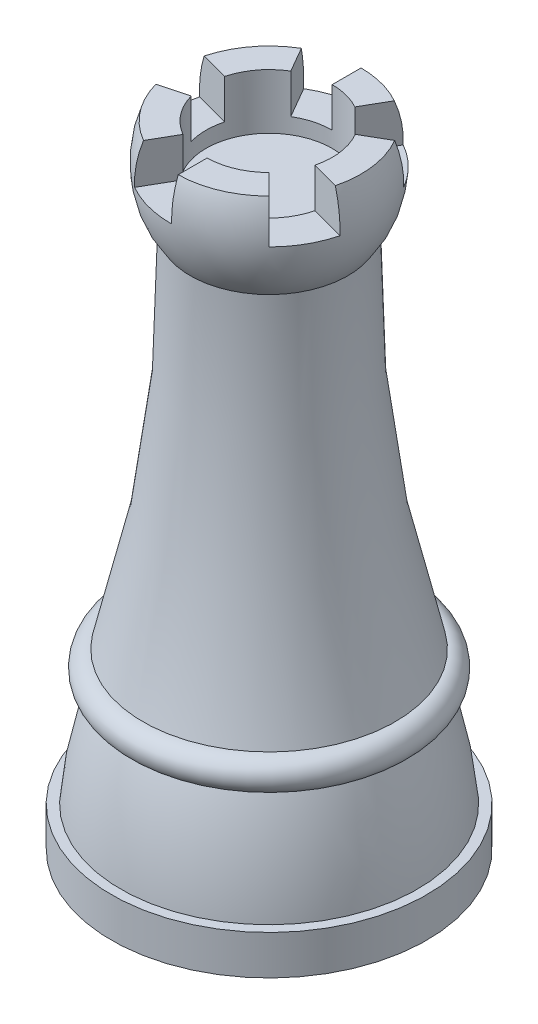
ISO-10303-21;
HEADER;
FILE_DESCRIPTION(('STEP AP214'),'2;1');
FILE_NAME('part.step','',(''),(''),'','','');
FILE_SCHEMA(('AUTOMOTIVE_DESIGN { 1 0 10303 214 1 1 1 1 }'));
ENDSEC;
DATA;
#1=APPLICATION_CONTEXT('core data for automotive mechanical design processes');
#2=APPLICATION_PROTOCOL_DEFINITION('international standard','automotive_design',2000,#1);
#3=PRODUCT_CONTEXT('',#1,'mechanical');
#4=PRODUCT('Part','Part','',(#3));
#5=PRODUCT_RELATED_PRODUCT_CATEGORY('part','',(#4));
#6=PRODUCT_DEFINITION_FORMATION('','',#4);
#7=PRODUCT_DEFINITION_CONTEXT('part definition',#1,'design');
#8=PRODUCT_DEFINITION('design','',#6,#7);
#9=PRODUCT_DEFINITION_SHAPE('','',#8);
#10=(LENGTH_UNIT() NAMED_UNIT(*) SI_UNIT(.MILLI.,.METRE.));
#11=(NAMED_UNIT(*) PLANE_ANGLE_UNIT() SI_UNIT($,.RADIAN.));
#12=(NAMED_UNIT(*) SI_UNIT($,.STERADIAN.) SOLID_ANGLE_UNIT());
#13=UNCERTAINTY_MEASURE_WITH_UNIT(LENGTH_MEASURE(1.E-05),#10,'distance_accuracy_value','');
#14=(GEOMETRIC_REPRESENTATION_CONTEXT(3) GLOBAL_UNCERTAINTY_ASSIGNED_CONTEXT((#13)) GLOBAL_UNIT_ASSIGNED_CONTEXT((#10,
#11,#12)) REPRESENTATION_CONTEXT('',''));
#15=CARTESIAN_POINT('',(0.,0.,0.));
#16=DIRECTION('',(0.,0.,1.));
#17=DIRECTION('',(1.,0.,0.));
#18=AXIS2_PLACEMENT_3D('',#15,#16,#17);
#19=CARTESIAN_POINT('',(0.,50.8,0.));
#20=DIRECTION('',(0.,1.,0.));
#21=DIRECTION('',(0.,0.,1.));
#22=AXIS2_PLACEMENT_3D('',#19,#20,#21);
#23=PLANE('',#22);
#24=DIRECTION('',(0.866025403784433,0.,-0.50000000000001));
#25=VECTOR('',#24,1.);
#26=CARTESIAN_POINT('',(8.79881810244979,50.8,-5.08000000000008));
#27=LINE('',#26,#25);
#28=CARTESIAN_POINT('',(4.39940905122492,50.8,-2.54000000000005));
#29=VERTEX_POINT('',#28);
#30=CARTESIAN_POINT('',(6.41318563585988,50.8,-3.70265445322684));
#31=VERTEX_POINT('',#30);
#32=EDGE_CURVE('E253',#29,#31,#27,.T.);
#33=ORIENTED_EDGE('',*,*,#32,.F.);
#34=CARTESIAN_POINT('',(0.,50.8,0.));
#35=DIRECTION('',(0.,1.,0.));
#36=DIRECTION('',(0.,0.,1.));
#37=AXIS2_PLACEMENT_3D('',#34,#35,#36);
#38=CIRCLE('',#37,5.08);
#39=CARTESIAN_POINT('',(4.92771782049568,50.8,1.23450276693466));
#40=VERTEX_POINT('',#39);
#41=EDGE_CURVE('E422',#40,#29,#38,.T.);
#42=ORIENTED_EDGE('',*,*,#41,.F.);
#43=DIRECTION('',(-0.965925826289071,0.,-0.25881904510251));
#44=VECTOR('',#43,1.);
#45=CARTESIAN_POINT('',(9.67726605474819,50.8,2.50714038071522));
#46=LINE('',#45,#44);
#47=CARTESIAN_POINT('',(7.17399918189662,50.8,1.83639204369509));
#48=VERTEX_POINT('',#47);
#49=EDGE_CURVE('E237',#48,#40,#46,.T.);
#50=ORIENTED_EDGE('',*,*,#49,.F.);
#51=CARTESIAN_POINT('',(0.,50.8,0.));
#52=DIRECTION('',(0.,-1.,0.));
#53=DIRECTION('',(0.,0.,-1.));
#54=AXIS2_PLACEMENT_3D('',#51,#52,#53);
#55=CIRCLE('',#54,7.40530890645353);
#56=EDGE_CURVE('E53',#31,#48,#55,.T.);
#57=ORIENTED_EDGE('',*,*,#56,.F.);
#58=EDGE_LOOP('',(#33,#42,#50,#57));
#59=FACE_BOUND('',#58,.T.);
#60=ADVANCED_FACE('F44',(#59),#23,.T.);
#61=DIRECTION('',(0.707106781186554,0.,0.707106781186541));
#62=VECTOR('',#61,1.);
#63=CARTESIAN_POINT('',(7.18420489685535,50.8,7.18420489685522));
#64=LINE('',#63,#62);
#65=CARTESIAN_POINT('',(3.59210244842769,50.8,3.59210244842763));
#66=VERTEX_POINT('',#65);
#67=CARTESIAN_POINT('',(5.23634414453447,50.8,5.23634414453438));
#68=VERTEX_POINT('',#67);
#69=EDGE_CURVE('E230',#66,#68,#64,.T.);
#70=ORIENTED_EDGE('',*,*,#69,.F.);
#71=CARTESIAN_POINT('',(0.0829491156278542,50.8,5.0793227347961));
#72=VERTEX_POINT('',#71);
#73=EDGE_CURVE('E438',#72,#66,#38,.T.);
#74=ORIENTED_EDGE('',*,*,#73,.F.);
#75=DIRECTION('',(0.,0.,-1.));
#76=VECTOR('',#75,1.);
#77=CARTESIAN_POINT('',(0.0829491156278967,50.8,9.99641688942648));
#78=LINE('',#77,#76);
#79=CARTESIAN_POINT('',(0.0829491156278753,50.8,7.40484432275362));
#80=VERTEX_POINT('',#79);
#81=EDGE_CURVE('E246',#80,#72,#78,.T.);
#82=ORIENTED_EDGE('',*,*,#81,.F.);
#83=EDGE_CURVE('E403',#68,#80,#55,.T.);
#84=ORIENTED_EDGE('',*,*,#83,.F.);
#85=EDGE_LOOP('',(#70,#74,#82,#84));
#86=FACE_BOUND('',#85,.T.);
#87=ADVANCED_FACE('F436',(#86),#23,.T.);
#88=DIRECTION('',(-0.499999999999995,0.,0.866025403784442));
#89=VECTOR('',#88,1.);
#90=CARTESIAN_POINT('',(-5.07999999999992,50.8,8.79881810244988));
#91=LINE('',#90,#89);
#92=CARTESIAN_POINT('',(-2.53999999999997,50.8,4.39940905122496));
#93=VERTEX_POINT('',#92);
#94=CARTESIAN_POINT('',(-3.70265445322673,50.8,6.41318563585994));
#95=VERTEX_POINT('',#94);
#96=EDGE_CURVE('E223',#93,#95,#91,.T.);
#97=ORIENTED_EDGE('',*,*,#96,.F.);
#98=CARTESIAN_POINT('',(-4.88478019869788,50.8,1.39474815304022));
#99=VERTEX_POINT('',#98);
#100=EDGE_CURVE('E213',#99,#93,#38,.T.);
#101=ORIENTED_EDGE('',*,*,#100,.F.);
#102=DIRECTION('',(0.965925826289067,0.,-0.258819045102526));
#103=VECTOR('',#102,1.);
#104=CARTESIAN_POINT('',(-9.63432843295037,50.8,2.66738576682087));
#105=LINE('',#104,#103);
#106=CARTESIAN_POINT('',(-7.13106156009881,50.8,1.9966374298007));
#107=VERTEX_POINT('',#106);
#108=EDGE_CURVE('E215',#107,#99,#105,.T.);
#109=ORIENTED_EDGE('',*,*,#108,.F.);
#110=EDGE_CURVE('E396',#95,#107,#55,.T.);
#111=ORIENTED_EDGE('',*,*,#110,.F.);
#112=EDGE_LOOP('',(#97,#101,#109,#111));
#113=FACE_BOUND('',#112,.T.);
#114=ADVANCED_FACE('F446',(#113),#23,.T.);
#115=DIRECTION('',(-0.965925826289069,0.,-0.258819045102518));
#116=VECTOR('',#115,1.);
#117=CARTESIAN_POINT('',(-9.81380639509689,50.8,-2.62960149824157));
#118=LINE('',#117,#116);
#119=CARTESIAN_POINT('',(-4.90690319754847,50.8,-1.31480074912079));
#120=VERTEX_POINT('',#119);
#121=CARTESIAN_POINT('',(-7.15297912439193,50.8,-1.91663497985747));
#122=VERTEX_POINT('',#121);
#123=EDGE_CURVE('E219',#120,#122,#118,.T.);
#124=ORIENTED_EDGE('',*,*,#123,.F.);
#125=CARTESIAN_POINT('',(-2.6114974087532,50.8,-4.35734796453936));
#126=VERTEX_POINT('',#125);
#127=EDGE_CURVE('E368',#126,#120,#38,.T.);
#128=ORIENTED_EDGE('',*,*,#127,.F.);
#129=DIRECTION('',(0.500000000000002,0.,0.866025403784437));
#130=VECTOR('',#129,1.);
#131=CARTESIAN_POINT('',(-5.0700444860684,50.8,-8.61567641524923));
#132=LINE('',#131,#130);
#133=CARTESIAN_POINT('',(-3.77425820273197,50.8,-6.3713087367597));
#134=VERTEX_POINT('',#133);
#135=EDGE_CURVE('E326',#134,#126,#132,.T.);
#136=ORIENTED_EDGE('',*,*,#135,.F.);
#137=EDGE_CURVE('E54',#122,#134,#55,.T.);
#138=ORIENTED_EDGE('',*,*,#137,.F.);
#139=EDGE_LOOP('',(#124,#128,#136,#138));
#140=FACE_BOUND('',#139,.T.);
#141=ADVANCED_FACE('F460',(#140),#23,.T.);
#142=DIRECTION('',(-0.499999999999988,0.,0.866025403784446));
#143=VECTOR('',#142,1.);
#144=CARTESIAN_POINT('',(4.92637240335798,50.8,-8.69862553087713));
#145=LINE('',#144,#143);
#146=CARTESIAN_POINT('',(3.63058612002158,50.8,-6.45425785238757));
#147=VERTEX_POINT('',#146);
#148=CARTESIAN_POINT('',(2.46782532604285,50.8,-4.44029708016722));
#149=VERTEX_POINT('',#148);
#150=EDGE_CURVE('E260',#147,#149,#145,.T.);
#151=ORIENTED_EDGE('',*,*,#150,.F.);
#152=CARTESIAN_POINT('',(0.,50.8,-7.40530890645353));
#153=VERTEX_POINT('',#152);
#154=EDGE_CURVE('E11',#153,#147,#55,.T.);
#155=ORIENTED_EDGE('',*,*,#154,.F.);
#156=DIRECTION('',(0.,0.,-1.));
#157=VECTOR('',#156,1.);
#158=CARTESIAN_POINT('',(0.,50.8,-10.1599999999999));
#159=LINE('',#158,#157);
#160=CARTESIAN_POINT('',(0.,50.8,-5.08));
#161=VERTEX_POINT('',#160);
#162=EDGE_CURVE('E332',#161,#153,#159,.T.);
#163=ORIENTED_EDGE('',*,*,#162,.F.);
#164=EDGE_CURVE('E362',#149,#161,#38,.T.);
#165=ORIENTED_EDGE('',*,*,#164,.F.);
#166=EDGE_LOOP('',(#151,#155,#163,#165));
#167=FACE_BOUND('',#166,.T.);
#168=ADVANCED_FACE('F46',(#167),#23,.T.);
#169=CARTESIAN_POINT('',(0.,47.9425,0.));
#170=DIRECTION('',(0.,-1.,0.));
#171=DIRECTION('',(1.,0.,0.));
#172=AXIS2_PLACEMENT_3D('',#169,#170,#171);
#173=SPHERICAL_SURFACE('',#172,7.9375);
#174=CARTESIAN_POINT('',(0.,47.9425,0.));
#175=DIRECTION('',(0.50000000000001,0.,0.866025403784433));
#176=DIRECTION('',(0.866025403784433,0.,-0.50000000000001));
#177=AXIS2_PLACEMENT_3D('',#174,#175,#176);
#178=CIRCLE('',#177,7.9375);
#179=CARTESIAN_POINT('',(6.86857517975886,47.625,-3.96557372898306));
#180=VERTEX_POINT('',#179);
#181=EDGE_CURVE('E323',#31,#180,#178,.F.);
#182=ORIENTED_EDGE('',*,*,#181,.F.);
#183=ORIENTED_EDGE('',*,*,#56,.T.);
#184=CARTESIAN_POINT('',(0.0214688108988885,47.9425,-0.0801226930527438));
#185=DIRECTION('',(0.25881904510251,0.,-0.965925826289071));
#186=DIRECTION('',(-0.965925826289071,0.,-0.25881904510251));
#187=AXIS2_PLACEMENT_3D('',#184,#185,#186);
#188=CIRCLE('',#187,7.9370665673293);
#189=CARTESIAN_POINT('',(7.68194997349271,47.625,1.97249704809801));
#190=VERTEX_POINT('',#189);
#191=EDGE_CURVE('E310',#190,#48,#188,.F.);
#192=ORIENTED_EDGE('',*,*,#191,.F.);
#193=CARTESIAN_POINT('',(0.,47.625,0.));
#194=DIRECTION('',(0.,1.,0.));
#195=DIRECTION('',(0.,0.,1.));
#196=AXIS2_PLACEMENT_3D('',#193,#194,#195);
#197=CIRCLE('',#196,7.93114745796597);
#198=CARTESIAN_POINT('',(5.60816815011823,47.625,5.60816815011813));
#199=VERTEX_POINT('',#198);
#200=EDGE_CURVE('E306',#190,#199,#197,.F.);
#201=ORIENTED_EDGE('',*,*,#200,.T.);
#202=CARTESIAN_POINT('',(0.,47.9425,0.));
#203=DIRECTION('',(-0.707106781186541,0.,0.707106781186554));
#204=DIRECTION('',(0.707106781186554,0.,0.707106781186541));
#205=AXIS2_PLACEMENT_3D('',#202,#203,#204);
#206=CIRCLE('',#205,7.9375);
#207=EDGE_CURVE('E313',#68,#199,#206,.F.);
#208=ORIENTED_EDGE('',*,*,#207,.F.);
#209=ORIENTED_EDGE('',*,*,#83,.T.);
#210=CARTESIAN_POINT('',(0.082949115627814,47.9425,0.));
#211=DIRECTION('',(1.,0.,0.));
#212=DIRECTION('',(0.,0.,-1.));
#213=AXIS2_PLACEMENT_3D('',#210,#211,#212);
#214=CIRCLE('',#213,7.9370665673293);
#215=CARTESIAN_POINT('',(0.0829491156278796,47.625,7.9307136781135));
#216=VERTEX_POINT('',#215);
#217=EDGE_CURVE('E301',#216,#80,#214,.F.);
#218=ORIENTED_EDGE('',*,*,#217,.F.);
#219=CARTESIAN_POINT('',(0.,47.625,0.));
#220=DIRECTION('',(0.,1.,0.));
#221=DIRECTION('',(0.,0.,1.));
#222=AXIS2_PLACEMENT_3D('',#219,#220,#221);
#223=CIRCLE('',#222,7.93114745796597);
#224=CARTESIAN_POINT('',(-3.96557372898294,47.625,6.86857517975892));
#225=VERTEX_POINT('',#224);
#226=EDGE_CURVE('E298',#216,#225,#223,.F.);
#227=ORIENTED_EDGE('',*,*,#226,.T.);
#228=CARTESIAN_POINT('',(0.,47.9425,0.));
#229=DIRECTION('',(-0.866025403784442,0.,-0.499999999999995));
#230=DIRECTION('',(-0.499999999999995,0.,0.866025403784442));
#231=AXIS2_PLACEMENT_3D('',#228,#229,#230);
#232=CIRCLE('',#231,7.9375);
#233=EDGE_CURVE('E203',#95,#225,#232,.F.);
#234=ORIENTED_EDGE('',*,*,#233,.F.);
#235=ORIENTED_EDGE('',*,*,#110,.T.);
#236=CARTESIAN_POINT('',(0.0214688108988899,47.9425,0.0801226930527439));
#237=DIRECTION('',(0.258819045102526,0.,0.965925826289067));
#238=DIRECTION('',(0.965925826289067,0.,-0.258819045102526));
#239=AXIS2_PLACEMENT_3D('',#236,#237,#238);
#240=CIRCLE('',#239,7.9370665673293);
#241=CARTESIAN_POINT('',(-7.6390123516949,47.625,2.13274243420362));
#242=VERTEX_POINT('',#241);
#243=EDGE_CURVE('E292',#242,#107,#240,.F.);
#244=ORIENTED_EDGE('',*,*,#243,.F.);
#245=CARTESIAN_POINT('',(0.,47.625,0.));
#246=DIRECTION('',(0.,1.,0.));
#247=DIRECTION('',(0.,0.,1.));
#248=AXIS2_PLACEMENT_3D('',#245,#246,#247);
#249=CIRCLE('',#248,7.93114745796597);
#250=CARTESIAN_POINT('',(-7.66090016175623,47.625,-2.05273201163801));
#251=VERTEX_POINT('',#250);
#252=EDGE_CURVE('E286',#242,#251,#249,.F.);
#253=ORIENTED_EDGE('',*,*,#252,.T.);
#254=CARTESIAN_POINT('',(0.,47.9425,0.));
#255=DIRECTION('',(0.258819045102518,0.,-0.965925826289069));
#256=DIRECTION('',(-0.965925826289069,0.,-0.258819045102518));
#257=AXIS2_PLACEMENT_3D('',#254,#255,#256);
#258=CIRCLE('',#257,7.9375);
#259=EDGE_CURVE('E295',#122,#251,#258,.F.);
#260=ORIENTED_EDGE('',*,*,#259,.F.);
#261=ORIENTED_EDGE('',*,*,#137,.T.);
#262=CARTESIAN_POINT('',(-0.0718360413551399,47.9425,0.0414745578139073));
#263=DIRECTION('',(-0.866025403784437,0.,0.500000000000002));
#264=DIRECTION('',(0.500000000000002,0.,0.866025403784437));
#265=AXIS2_PLACEMENT_3D('',#262,#263,#264);
#266=CIRCLE('',#265,7.9370665673293);
#267=CARTESIAN_POINT('',(-4.03719288041191,47.625,-6.8267249575731));
#268=VERTEX_POINT('',#267);
#269=EDGE_CURVE('E355',#268,#134,#266,.F.);
#270=ORIENTED_EDGE('',*,*,#269,.F.);
#271=CARTESIAN_POINT('',(0.,47.625,0.));
#272=DIRECTION('',(0.,1.,0.));
#273=DIRECTION('',(0.,0.,1.));
#274=AXIS2_PLACEMENT_3D('',#271,#272,#273);
#275=CIRCLE('',#274,7.93114745796597);
#276=CARTESIAN_POINT('',(0.,47.625,-7.93114745796597));
#277=VERTEX_POINT('',#276);
#278=EDGE_CURVE('E348',#268,#277,#275,.F.);
#279=ORIENTED_EDGE('',*,*,#278,.T.);
#280=CARTESIAN_POINT('',(0.,47.9425,0.));
#281=DIRECTION('',(1.,0.,0.));
#282=DIRECTION('',(0.,0.,-1.));
#283=AXIS2_PLACEMENT_3D('',#280,#281,#282);
#284=CIRCLE('',#283,7.9375);
#285=EDGE_CURVE('E359',#153,#277,#284,.F.);
#286=ORIENTED_EDGE('',*,*,#285,.F.);
#287=ORIENTED_EDGE('',*,*,#154,.T.);
#288=CARTESIAN_POINT('',(-0.0718360413551413,47.9425,-0.0414745578139066));
#289=DIRECTION('',(-0.866025403784446,0.,-0.499999999999988));
#290=DIRECTION('',(-0.499999999999988,0.,0.866025403784446));
#291=AXIS2_PLACEMENT_3D('',#288,#289,#290);
#292=CIRCLE('',#291,7.9370665673293);
#293=CARTESIAN_POINT('',(3.89352079770151,47.625,-6.90967407320098));
#294=VERTEX_POINT('',#293);
#295=EDGE_CURVE('E320',#294,#147,#292,.F.);
#296=ORIENTED_EDGE('',*,*,#295,.F.);
#297=CARTESIAN_POINT('',(0.,47.625,0.));
#298=DIRECTION('',(0.,1.,0.));
#299=DIRECTION('',(0.,0.,1.));
#300=AXIS2_PLACEMENT_3D('',#297,#298,#299);
#301=CIRCLE('',#300,7.93114745796597);
#302=EDGE_CURVE('E316',#294,#180,#301,.F.);
#303=ORIENTED_EDGE('',*,*,#302,.T.);
#304=EDGE_LOOP('',(#182,#183,#192,#201,#208,#209,#218,#227,#234,#235,#244,#253,#260,#261,#270,
#279,#286,#287,#296,#303));
#305=FACE_BOUND('',#304,.T.);
#306=CARTESIAN_POINT('',(0.,43.18,0.));
#307=DIRECTION('',(0.,-1.,0.));
#308=DIRECTION('',(0.,0.,-1.));
#309=AXIS2_PLACEMENT_3D('',#306,#307,#308);
#310=CIRCLE('',#309,6.34999999999999);
#311=CARTESIAN_POINT('',(0.,43.18,-6.34999999999999));
#312=VERTEX_POINT('',#311);
#313=EDGE_CURVE('E390',#312,#312,#310,.T.);
#314=ORIENTED_EDGE('',*,*,#313,.F.);
#315=EDGE_LOOP('',(#314));
#316=FACE_BOUND('',#315,.T.);
#317=ADVANCED_FACE('F416',(#305,#316),#173,.T.);
#318=CARTESIAN_POINT('',(0.,41.2449258227173,0.));
#319=DIRECTION('',(0.,-1.,0.));
#320=DIRECTION('',(0.,0.,-1.));
#321=AXIS2_PLACEMENT_3D('',#318,#319,#320);
#322=TOROIDAL_SURFACE('',#321,105.391097974166,99.06);
#323=ORIENTED_EDGE('',*,*,#313,.T.);
#324=EDGE_LOOP('',(#323));
#325=FACE_BOUND('',#324,.T.);
#326=CARTESIAN_POINT('',(0.,13.97,0.));
#327=DIRECTION('',(0.,-1.,0.));
#328=DIRECTION('',(0.,0.,-1.));
#329=AXIS2_PLACEMENT_3D('',#326,#327,#328);
#330=CIRCLE('',#329,10.16);
#331=CARTESIAN_POINT('',(0.,13.97,-10.16));
#332=VERTEX_POINT('',#331);
#333=EDGE_CURVE('E387',#332,#332,#330,.T.);
#334=ORIENTED_EDGE('',*,*,#333,.F.);
#335=EDGE_LOOP('',(#334));
#336=FACE_BOUND('',#335,.T.);
#337=ADVANCED_FACE('F505',(#325,#336),#322,.F.);
#338=CARTESIAN_POINT('',(0.,12.7,0.));
#339=DIRECTION('',(0.,-1.,0.));
#340=DIRECTION('',(0.,0.,-1.));
#341=AXIS2_PLACEMENT_3D('',#338,#339,#340);
#342=TOROIDAL_SURFACE('',#341,10.16,1.27);
#343=ORIENTED_EDGE('',*,*,#333,.T.);
#344=EDGE_LOOP('',(#343));
#345=FACE_BOUND('',#344,.T.);
#346=CARTESIAN_POINT('',(0.,11.43,0.));
#347=DIRECTION('',(0.,-1.,0.));
#348=DIRECTION('',(0.,0.,-1.));
#349=AXIS2_PLACEMENT_3D('',#346,#347,#348);
#350=CIRCLE('',#349,10.16);
#351=CARTESIAN_POINT('',(0.,11.43,-10.16));
#352=VERTEX_POINT('',#351);
#353=EDGE_CURVE('E383',#352,#352,#350,.T.);
#354=ORIENTED_EDGE('',*,*,#353,.F.);
#355=EDGE_LOOP('',(#354));
#356=FACE_BOUND('',#355,.T.);
#357=ADVANCED_FACE('F637',(#345,#356),#342,.T.);
#358=CARTESIAN_POINT('',(0.,0.676718395339822,0.));
#359=DIRECTION('',(0.,-1.,0.));
#360=DIRECTION('',(0.,0.,-1.));
#361=AXIS2_PLACEMENT_3D('',#358,#359,#360);
#362=DEGENERATE_TOROIDAL_SURFACE('',#361,19.713557450208,31.75,.F.);
#363=ORIENTED_EDGE('',*,*,#353,.T.);
#364=EDGE_LOOP('',(#363));
#365=FACE_BOUND('',#364,.T.);
#366=CARTESIAN_POINT('',(0.,3.175,0.));
#367=DIRECTION('',(0.,-1.,0.));
#368=DIRECTION('',(0.,0.,-1.));
#369=AXIS2_PLACEMENT_3D('',#366,#367,#368);
#370=CIRCLE('',#369,11.938);
#371=CARTESIAN_POINT('',(0.,3.175,-11.938));
#372=VERTEX_POINT('',#371);
#373=EDGE_CURVE('E379',#372,#372,#370,.T.);
#374=ORIENTED_EDGE('',*,*,#373,.F.);
#375=EDGE_LOOP('',(#374));
#376=FACE_BOUND('',#375,.T.);
#377=ADVANCED_FACE('F646',(#365,#376),#362,.F.);
#378=CARTESIAN_POINT('',(12.7,3.175,0.));
#379=DIRECTION('',(0.,1.,0.));
#380=DIRECTION('',(0.,0.,1.));
#381=AXIS2_PLACEMENT_3D('',#378,#379,#380);
#382=PLANE('',#381);
#383=ORIENTED_EDGE('',*,*,#373,.T.);
#384=EDGE_LOOP('',(#383));
#385=FACE_BOUND('',#384,.T.);
#386=CARTESIAN_POINT('',(0.,3.175,0.));
#387=DIRECTION('',(0.,-1.,0.));
#388=DIRECTION('',(0.,0.,-1.));
#389=AXIS2_PLACEMENT_3D('',#386,#387,#388);
#390=CIRCLE('',#389,12.7);
#391=CARTESIAN_POINT('',(0.,3.175,-12.7));
#392=VERTEX_POINT('',#391);
#393=EDGE_CURVE('E375',#392,#392,#390,.T.);
#394=ORIENTED_EDGE('',*,*,#393,.F.);
#395=EDGE_LOOP('',(#394));
#396=FACE_BOUND('',#395,.T.);
#397=ADVANCED_FACE('F656',(#385,#396),#382,.T.);
#398=CARTESIAN_POINT('',(0.,0.,0.));
#399=DIRECTION('',(0.,-1.,0.));
#400=DIRECTION('',(0.,0.,-1.));
#401=AXIS2_PLACEMENT_3D('',#398,#399,#400);
#402=CYLINDRICAL_SURFACE('',#401,12.7);
#403=ORIENTED_EDGE('',*,*,#393,.T.);
#404=EDGE_LOOP('',(#403));
#405=FACE_BOUND('',#404,.T.);
#406=CARTESIAN_POINT('',(0.,0.,0.));
#407=DIRECTION('',(0.,-1.,0.));
#408=DIRECTION('',(0.,0.,-1.));
#409=AXIS2_PLACEMENT_3D('',#406,#407,#408);
#410=CIRCLE('',#409,12.7);
#411=CARTESIAN_POINT('',(0.,0.,-12.7));
#412=VERTEX_POINT('',#411);
#413=EDGE_CURVE('E367',#412,#412,#410,.T.);
#414=ORIENTED_EDGE('',*,*,#413,.F.);
#415=EDGE_LOOP('',(#414));
#416=FACE_BOUND('',#415,.T.);
#417=ADVANCED_FACE('F666',(#405,#416),#402,.T.);
#418=CARTESIAN_POINT('',(0.,0.,0.));
#419=DIRECTION('',(0.,-1.,0.));
#420=DIRECTION('',(0.,0.,-1.));
#421=AXIS2_PLACEMENT_3D('',#418,#419,#420);
#422=PLANE('',#421);
#423=ORIENTED_EDGE('',*,*,#413,.T.);
#424=EDGE_LOOP('',(#423));
#425=FACE_BOUND('',#424,.T.);
#426=ADVANCED_FACE('F615',(#425),#422,.T.);
#427=CARTESIAN_POINT('',(0.,46.355,0.));
#428=DIRECTION('',(0.,1.,0.));
#429=DIRECTION('',(0.,0.,1.));
#430=AXIS2_PLACEMENT_3D('',#427,#428,#429);
#431=CYLINDRICAL_SURFACE('',#430,5.08);
#432=ORIENTED_EDGE('',*,*,#41,.T.);
#433=DIRECTION('',(0.,1.,0.));
#434=VECTOR('',#433,1.);
#435=CARTESIAN_POINT('',(4.39940905122492,47.625,-2.54000000000005));
#436=LINE('',#435,#434);
#437=CARTESIAN_POINT('',(4.39940905122492,47.625,-2.54000000000005));
#438=VERTEX_POINT('',#437);
#439=EDGE_CURVE('E240',#438,#29,#436,.T.);
#440=ORIENTED_EDGE('',*,*,#439,.F.);
#441=CARTESIAN_POINT('',(0.,47.625,0.));
#442=DIRECTION('',(0.,-1.,0.));
#443=DIRECTION('',(-0.866025403784433,0.,0.50000000000001));
#444=AXIS2_PLACEMENT_3D('',#441,#442,#443);
#445=CIRCLE('',#444,5.08000000000005);
#446=CARTESIAN_POINT('',(2.46782532604285,47.625,-4.44029708016722));
#447=VERTEX_POINT('',#446);
#448=EDGE_CURVE('E252',#447,#438,#445,.T.);
#449=ORIENTED_EDGE('',*,*,#448,.F.);
#450=DIRECTION('',(0.,1.,0.));
#451=VECTOR('',#450,1.);
#452=CARTESIAN_POINT('',(2.46782532604285,47.625,-4.44029708016722));
#453=LINE('',#452,#451);
#454=EDGE_CURVE('E61',#447,#149,#453,.T.);
#455=ORIENTED_EDGE('',*,*,#454,.T.);
#456=ORIENTED_EDGE('',*,*,#164,.T.);
#457=DIRECTION('',(0.,1.,0.));
#458=VECTOR('',#457,1.);
#459=CARTESIAN_POINT('',(0.,47.625,-5.08));
#460=LINE('',#459,#458);
#461=CARTESIAN_POINT('',(0.,47.625,-5.08));
#462=VERTEX_POINT('',#461);
#463=EDGE_CURVE('E344',#462,#161,#460,.T.);
#464=ORIENTED_EDGE('',*,*,#463,.F.);
#465=CARTESIAN_POINT('',(0.,47.625,0.));
#466=DIRECTION('',(0.,-1.,0.));
#467=DIRECTION('',(0.,0.,1.));
#468=AXIS2_PLACEMENT_3D('',#465,#466,#467);
#469=CIRCLE('',#468,5.08000000000005);
#470=CARTESIAN_POINT('',(-2.6114974087532,47.625,-4.35734796453936));
#471=VERTEX_POINT('',#470);
#472=EDGE_CURVE('E331',#471,#462,#469,.T.);
#473=ORIENTED_EDGE('',*,*,#472,.F.);
#474=DIRECTION('',(0.,1.,0.));
#475=VECTOR('',#474,1.);
#476=CARTESIAN_POINT('',(-2.6114974087532,47.625,-4.35734796453936));
#477=LINE('',#476,#475);
#478=EDGE_CURVE('E339',#471,#126,#477,.T.);
#479=ORIENTED_EDGE('',*,*,#478,.T.);
#480=ORIENTED_EDGE('',*,*,#127,.T.);
#481=DIRECTION('',(0.,1.,0.));
#482=VECTOR('',#481,1.);
#483=CARTESIAN_POINT('',(-4.90690319754847,47.625,-1.31480074912079));
#484=LINE('',#483,#482);
#485=CARTESIAN_POINT('',(-4.90690319754847,47.625,-1.31480074912079));
#486=VERTEX_POINT('',#485);
#487=EDGE_CURVE('E283',#486,#120,#484,.T.);
#488=ORIENTED_EDGE('',*,*,#487,.F.);
#489=CARTESIAN_POINT('',(0.,47.625,0.));
#490=DIRECTION('',(0.,-1.,0.));
#491=DIRECTION('',(0.965925826289069,0.,0.258819045102518));
#492=AXIS2_PLACEMENT_3D('',#489,#490,#491);
#493=CIRCLE('',#492,5.08000000000005);
#494=CARTESIAN_POINT('',(-4.88478019869788,47.625,1.39474815304022));
#495=VERTEX_POINT('',#494);
#496=EDGE_CURVE('E273',#495,#486,#493,.T.);
#497=ORIENTED_EDGE('',*,*,#496,.F.);
#498=DIRECTION('',(0.,1.,0.));
#499=VECTOR('',#498,1.);
#500=CARTESIAN_POINT('',(-4.88478019869788,47.625,1.39474815304022));
#501=LINE('',#500,#499);
#502=EDGE_CURVE('E279',#495,#99,#501,.T.);
#503=ORIENTED_EDGE('',*,*,#502,.T.);
#504=ORIENTED_EDGE('',*,*,#100,.T.);
#505=DIRECTION('',(0.,1.,0.));
#506=VECTOR('',#505,1.);
#507=CARTESIAN_POINT('',(-2.53999999999997,47.625,4.39940905122496));
#508=LINE('',#507,#506);
#509=CARTESIAN_POINT('',(-2.53999999999997,47.625,4.39940905122496));
#510=VERTEX_POINT('',#509);
#511=EDGE_CURVE('E200',#510,#93,#508,.T.);
#512=ORIENTED_EDGE('',*,*,#511,.F.);
#513=CARTESIAN_POINT('',(0.,47.625,0.));
#514=DIRECTION('',(0.,-1.,0.));
#515=DIRECTION('',(0.499999999999995,0.,-0.866025403784442));
#516=AXIS2_PLACEMENT_3D('',#513,#514,#515);
#517=CIRCLE('',#516,5.08000000000005);
#518=CARTESIAN_POINT('',(0.0829491156278542,47.625,5.0793227347961));
#519=VERTEX_POINT('',#518);
#520=EDGE_CURVE('E186',#519,#510,#517,.T.);
#521=ORIENTED_EDGE('',*,*,#520,.F.);
#522=DIRECTION('',(0.,1.,0.));
#523=VECTOR('',#522,1.);
#524=CARTESIAN_POINT('',(0.0829491156278542,47.625,5.0793227347961));
#525=LINE('',#524,#523);
#526=EDGE_CURVE('E205',#519,#72,#525,.T.);
#527=ORIENTED_EDGE('',*,*,#526,.T.);
#528=ORIENTED_EDGE('',*,*,#73,.T.);
#529=DIRECTION('',(0.,1.,0.));
#530=VECTOR('',#529,1.);
#531=CARTESIAN_POINT('',(3.59210244842769,47.625,3.59210244842763));
#532=LINE('',#531,#530);
#533=CARTESIAN_POINT('',(3.59210244842769,47.625,3.59210244842763));
#534=VERTEX_POINT('',#533);
#535=EDGE_CURVE('E243',#534,#66,#532,.T.);
#536=ORIENTED_EDGE('',*,*,#535,.F.);
#537=CARTESIAN_POINT('',(0.,47.625,0.));
#538=DIRECTION('',(0.,-1.,0.));
#539=DIRECTION('',(-0.707106781186554,0.,-0.707106781186541));
#540=AXIS2_PLACEMENT_3D('',#537,#538,#539);
#541=CIRCLE('',#540,5.08000000000005);
#542=CARTESIAN_POINT('',(4.92771782049568,47.625,1.23450276693466));
#543=VERTEX_POINT('',#542);
#544=EDGE_CURVE('E229',#543,#534,#541,.T.);
#545=ORIENTED_EDGE('',*,*,#544,.F.);
#546=DIRECTION('',(0.,1.,0.));
#547=VECTOR('',#546,1.);
#548=CARTESIAN_POINT('',(4.92771782049568,47.625,1.23450276693466));
#549=LINE('',#548,#547);
#550=EDGE_CURVE('E69',#543,#40,#549,.T.);
#551=ORIENTED_EDGE('',*,*,#550,.T.);
#552=EDGE_LOOP('',(#432,#440,#449,#455,#456,#464,#473,#479,#480,#488,#497,#503,#504,#512,#521,
#527,#528,#536,#545,#551));
#553=FACE_BOUND('',#552,.T.);
#554=CARTESIAN_POINT('',(0.,46.355,0.));
#555=DIRECTION('',(0.,1.,0.));
#556=DIRECTION('',(0.,0.,1.));
#557=AXIS2_PLACEMENT_3D('',#554,#555,#556);
#558=CIRCLE('',#557,5.08);
#559=CARTESIAN_POINT('',(0.,46.355,5.08));
#560=VERTEX_POINT('',#559);
#561=EDGE_CURVE('E363',#560,#560,#558,.T.);
#562=ORIENTED_EDGE('',*,*,#561,.F.);
#563=EDGE_LOOP('',(#562));
#564=FACE_BOUND('',#563,.T.);
#565=ADVANCED_FACE('F209',(#553,#564),#431,.F.);
#566=CARTESIAN_POINT('',(0.,46.355,0.));
#567=DIRECTION('',(0.,1.,0.));
#568=DIRECTION('',(0.,0.,1.));
#569=AXIS2_PLACEMENT_3D('',#566,#567,#568);
#570=PLANE('',#569);
#571=ORIENTED_EDGE('',*,*,#561,.T.);
#572=EDGE_LOOP('',(#571));
#573=FACE_BOUND('',#572,.T.);
#574=ADVANCED_FACE('F614',(#573),#570,.T.);
#575=CARTESIAN_POINT('',(0.,47.625,-10.1599999999999));
#576=DIRECTION('',(1.,0.,0.));
#577=DIRECTION('',(0.,0.,-1.));
#578=AXIS2_PLACEMENT_3D('',#575,#576,#577);
#579=PLANE('',#578);
#580=ORIENTED_EDGE('',*,*,#285,.T.);
#581=DIRECTION('',(0.,0.,-1.));
#582=VECTOR('',#581,1.);
#583=CARTESIAN_POINT('',(0.,47.625,-10.1599999999999));
#584=LINE('',#583,#582);
#585=EDGE_CURVE('E335',#462,#277,#584,.T.);
#586=ORIENTED_EDGE('',*,*,#585,.F.);
#587=ORIENTED_EDGE('',*,*,#463,.T.);
#588=ORIENTED_EDGE('',*,*,#162,.T.);
#589=EDGE_LOOP('',(#580,#586,#587,#588));
#590=FACE_BOUND('',#589,.T.);
#591=ADVANCED_FACE('F471',(#590),#579,.F.);
#592=CARTESIAN_POINT('',(-5.0700444860684,47.625,-8.61567641524923));
#593=DIRECTION('',(-0.866025403784437,0.,0.500000000000002));
#594=DIRECTION('',(0.500000000000002,0.,0.866025403784437));
#595=AXIS2_PLACEMENT_3D('',#592,#593,#594);
#596=PLANE('',#595);
#597=ORIENTED_EDGE('',*,*,#269,.T.);
#598=ORIENTED_EDGE('',*,*,#135,.T.);
#599=ORIENTED_EDGE('',*,*,#478,.F.);
#600=DIRECTION('',(0.500000000000002,0.,0.866025403784437));
#601=VECTOR('',#600,1.);
#602=CARTESIAN_POINT('',(-5.0700444860684,47.625,-8.61567641524923));
#603=LINE('',#602,#601);
#604=EDGE_CURVE('E327',#268,#471,#603,.T.);
#605=ORIENTED_EDGE('',*,*,#604,.F.);
#606=EDGE_LOOP('',(#597,#598,#599,#605));
#607=FACE_BOUND('',#606,.T.);
#608=ADVANCED_FACE('F463',(#607),#596,.F.);
#609=CARTESIAN_POINT('',(0.322927529640268,47.625,-0.00513329429669383));
#610=DIRECTION('',(0.,1.,0.));
#611=DIRECTION('',(0.,0.,1.));
#612=AXIS2_PLACEMENT_3D('',#609,#610,#611);
#613=PLANE('',#612);
#614=ORIENTED_EDGE('',*,*,#604,.T.);
#615=ORIENTED_EDGE('',*,*,#472,.T.);
#616=ORIENTED_EDGE('',*,*,#585,.T.);
#617=ORIENTED_EDGE('',*,*,#278,.F.);
#618=EDGE_LOOP('',(#614,#615,#616,#617));
#619=FACE_BOUND('',#618,.T.);
#620=ADVANCED_FACE('F469',(#619),#613,.T.);
#621=CARTESIAN_POINT('',(-9.81380639509689,47.625,-2.62960149824157));
#622=DIRECTION('',(0.258819045102518,0.,-0.965925826289069));
#623=DIRECTION('',(-0.965925826289069,0.,-0.258819045102518));
#624=AXIS2_PLACEMENT_3D('',#621,#622,#623);
#625=PLANE('',#624);
#626=ORIENTED_EDGE('',*,*,#259,.T.);
#627=DIRECTION('',(-0.965925826289069,0.,-0.258819045102518));
#628=VECTOR('',#627,1.);
#629=CARTESIAN_POINT('',(-9.81380639509689,47.625,-2.62960149824157));
#630=LINE('',#629,#628);
#631=EDGE_CURVE('E276',#486,#251,#630,.T.);
#632=ORIENTED_EDGE('',*,*,#631,.F.);
#633=ORIENTED_EDGE('',*,*,#487,.T.);
#634=ORIENTED_EDGE('',*,*,#123,.T.);
#635=EDGE_LOOP('',(#626,#632,#633,#634));
#636=FACE_BOUND('',#635,.T.);
#637=ADVANCED_FACE('F456',(#636),#625,.F.);
#638=CARTESIAN_POINT('',(-9.63432843295037,47.625,2.66738576682087));
#639=DIRECTION('',(0.258819045102526,0.,0.965925826289067));
#640=DIRECTION('',(0.965925826289067,0.,-0.258819045102526));
#641=AXIS2_PLACEMENT_3D('',#638,#639,#640);
#642=PLANE('',#641);
#643=ORIENTED_EDGE('',*,*,#243,.T.);
#644=ORIENTED_EDGE('',*,*,#108,.T.);
#645=ORIENTED_EDGE('',*,*,#502,.F.);
#646=DIRECTION('',(0.965925826289067,0.,-0.258819045102526));
#647=VECTOR('',#646,1.);
#648=CARTESIAN_POINT('',(-9.63432843295037,47.625,2.66738576682087));
#649=LINE('',#648,#647);
#650=EDGE_CURVE('E269',#242,#495,#649,.T.);
#651=ORIENTED_EDGE('',*,*,#650,.F.);
#652=EDGE_LOOP('',(#643,#644,#645,#651));
#653=FACE_BOUND('',#652,.T.);
#654=ADVANCED_FACE('F448',(#653),#642,.F.);
#655=CARTESIAN_POINT('',(0.0786214133236903,47.625,-0.313252635227364));
#656=DIRECTION('',(0.,1.,0.));
#657=DIRECTION('',(0.965925826289069,0.,0.258819045102518));
#658=AXIS2_PLACEMENT_3D('',#655,#656,#657);
#659=PLANE('',#658);
#660=ORIENTED_EDGE('',*,*,#650,.T.);
#661=ORIENTED_EDGE('',*,*,#496,.T.);
#662=ORIENTED_EDGE('',*,*,#631,.T.);
#663=ORIENTED_EDGE('',*,*,#252,.F.);
#664=EDGE_LOOP('',(#660,#661,#662,#663));
#665=FACE_BOUND('',#664,.T.);
#666=ADVANCED_FACE('F454',(#665),#659,.T.);
#667=CARTESIAN_POINT('',(-5.07999999999992,47.625,8.79881810244988));
#668=DIRECTION('',(-0.866025403784442,0.,-0.499999999999995));
#669=DIRECTION('',(-0.499999999999995,0.,0.866025403784442));
#670=AXIS2_PLACEMENT_3D('',#667,#668,#669);
#671=PLANE('',#670);
#672=ORIENTED_EDGE('',*,*,#233,.T.);
#673=DIRECTION('',(-0.499999999999995,0.,0.866025403784442));
#674=VECTOR('',#673,1.);
#675=CARTESIAN_POINT('',(-5.07999999999992,47.625,8.79881810244988));
#676=LINE('',#675,#674);
#677=EDGE_CURVE('E189',#510,#225,#676,.T.);
#678=ORIENTED_EDGE('',*,*,#677,.F.);
#679=ORIENTED_EDGE('',*,*,#511,.T.);
#680=ORIENTED_EDGE('',*,*,#96,.T.);
#681=EDGE_LOOP('',(#672,#678,#679,#680));
#682=FACE_BOUND('',#681,.T.);
#683=ADVANCED_FACE('F199',(#682),#671,.F.);
#684=CARTESIAN_POINT('',(0.0829491156278967,47.625,9.99641688942648));
#685=DIRECTION('',(1.,0.,0.));
#686=DIRECTION('',(0.,0.,-1.));
#687=AXIS2_PLACEMENT_3D('',#684,#685,#686);
#688=PLANE('',#687);
#689=ORIENTED_EDGE('',*,*,#217,.T.);
#690=ORIENTED_EDGE('',*,*,#81,.T.);
#691=ORIENTED_EDGE('',*,*,#526,.F.);
#692=DIRECTION('',(0.,0.,-1.));
#693=VECTOR('',#692,1.);
#694=CARTESIAN_POINT('',(0.0829491156278967,47.625,9.99641688942648));
#695=LINE('',#694,#693);
#696=EDGE_CURVE('E192',#216,#519,#695,.T.);
#697=ORIENTED_EDGE('',*,*,#696,.F.);
#698=EDGE_LOOP('',(#689,#690,#691,#697));
#699=FACE_BOUND('',#698,.T.);
#700=ADVANCED_FACE('F549',(#699),#688,.F.);
#701=CARTESIAN_POINT('',(-0.282230091398172,47.625,-0.157018201554094));
#702=DIRECTION('',(0.,1.,0.));
#703=DIRECTION('',(0.499999999999995,0.,-0.866025403784442));
#704=AXIS2_PLACEMENT_3D('',#701,#702,#703);
#705=PLANE('',#704);
#706=ORIENTED_EDGE('',*,*,#696,.T.);
#707=ORIENTED_EDGE('',*,*,#520,.T.);
#708=ORIENTED_EDGE('',*,*,#677,.T.);
#709=ORIENTED_EDGE('',*,*,#226,.F.);
#710=EDGE_LOOP('',(#706,#707,#708,#709));
#711=FACE_BOUND('',#710,.T.);
#712=ADVANCED_FACE('F188',(#711),#705,.T.);
#713=CARTESIAN_POINT('',(7.18420489685535,47.625,7.18420489685522));
#714=DIRECTION('',(-0.707106781186541,0.,0.707106781186554));
#715=DIRECTION('',(0.707106781186554,0.,0.707106781186541));
#716=AXIS2_PLACEMENT_3D('',#713,#714,#715);
#717=PLANE('',#716);
#718=ORIENTED_EDGE('',*,*,#207,.T.);
#719=DIRECTION('',(0.707106781186554,0.,0.707106781186541));
#720=VECTOR('',#719,1.);
#721=CARTESIAN_POINT('',(7.18420489685535,47.625,7.18420489685522));
#722=LINE('',#721,#720);
#723=EDGE_CURVE('E233',#534,#199,#722,.T.);
#724=ORIENTED_EDGE('',*,*,#723,.F.);
#725=ORIENTED_EDGE('',*,*,#535,.T.);
#726=ORIENTED_EDGE('',*,*,#69,.T.);
#727=EDGE_LOOP('',(#718,#724,#725,#726));
#728=FACE_BOUND('',#727,.T.);
#729=ADVANCED_FACE('F432',(#728),#717,.F.);
#730=CARTESIAN_POINT('',(9.67726605474819,47.625,2.50714038071522));
#731=DIRECTION('',(0.25881904510251,0.,-0.965925826289071));
#732=DIRECTION('',(-0.965925826289071,0.,-0.25881904510251));
#733=AXIS2_PLACEMENT_3D('',#730,#731,#732);
#734=PLANE('',#733);
#735=ORIENTED_EDGE('',*,*,#191,.T.);
#736=ORIENTED_EDGE('',*,*,#49,.T.);
#737=ORIENTED_EDGE('',*,*,#550,.F.);
#738=DIRECTION('',(-0.965925826289071,0.,-0.25881904510251));
#739=VECTOR('',#738,1.);
#740=CARTESIAN_POINT('',(9.67726605474819,47.625,2.50714038071522));
#741=LINE('',#740,#739);
#742=EDGE_CURVE('E226',#190,#543,#741,.T.);
#743=ORIENTED_EDGE('',*,*,#742,.F.);
#744=EDGE_LOOP('',(#735,#736,#737,#743));
#745=FACE_BOUND('',#744,.T.);
#746=ADVANCED_FACE('F423',(#745),#734,.F.);
#747=CARTESIAN_POINT('',(-0.224714458833433,47.625,0.231974033247474));
#748=DIRECTION('',(0.,1.,0.));
#749=DIRECTION('',(-0.707106781186554,0.,-0.707106781186541));
#750=AXIS2_PLACEMENT_3D('',#747,#748,#749);
#751=PLANE('',#750);
#752=ORIENTED_EDGE('',*,*,#742,.T.);
#753=ORIENTED_EDGE('',*,*,#544,.T.);
#754=ORIENTED_EDGE('',*,*,#723,.T.);
#755=ORIENTED_EDGE('',*,*,#200,.F.);
#756=EDGE_LOOP('',(#752,#753,#754,#755));
#757=FACE_BOUND('',#756,.T.);
#758=ADVANCED_FACE('F430',(#757),#751,.T.);
#759=CARTESIAN_POINT('',(8.79881810244979,47.625,-5.08000000000008));
#760=DIRECTION('',(0.50000000000001,0.,0.866025403784433));
#761=DIRECTION('',(0.866025403784433,0.,-0.50000000000001));
#762=AXIS2_PLACEMENT_3D('',#759,#760,#761);
#763=PLANE('',#762);
#764=ORIENTED_EDGE('',*,*,#181,.T.);
#765=DIRECTION('',(0.866025403784433,0.,-0.50000000000001));
#766=VECTOR('',#765,1.);
#767=CARTESIAN_POINT('',(8.79881810244979,47.625,-5.08000000000008));
#768=LINE('',#767,#766);
#769=EDGE_CURVE('E256',#438,#180,#768,.T.);
#770=ORIENTED_EDGE('',*,*,#769,.F.);
#771=ORIENTED_EDGE('',*,*,#439,.T.);
#772=ORIENTED_EDGE('',*,*,#32,.T.);
#773=EDGE_LOOP('',(#764,#770,#771,#772));
#774=FACE_BOUND('',#773,.T.);
#775=ADVANCED_FACE('F485',(#774),#763,.F.);
#776=CARTESIAN_POINT('',(4.92637240335798,47.625,-8.69862553087713));
#777=DIRECTION('',(-0.866025403784446,0.,-0.499999999999988));
#778=DIRECTION('',(-0.499999999999988,0.,0.866025403784446));
#779=AXIS2_PLACEMENT_3D('',#776,#777,#778);
#780=PLANE('',#779);
#781=ORIENTED_EDGE('',*,*,#295,.T.);
#782=ORIENTED_EDGE('',*,*,#150,.T.);
#783=ORIENTED_EDGE('',*,*,#454,.F.);
#784=DIRECTION('',(-0.499999999999988,0.,0.866025403784446));
#785=VECTOR('',#784,1.);
#786=CARTESIAN_POINT('',(4.92637240335798,47.625,-8.69862553087713));
#787=LINE('',#786,#785);
#788=EDGE_CURVE('E249',#294,#447,#787,.T.);
#789=ORIENTED_EDGE('',*,*,#788,.F.);
#790=EDGE_LOOP('',(#781,#782,#783,#789));
#791=FACE_BOUND('',#790,.T.);
#792=ADVANCED_FACE('F479',(#791),#780,.F.);
#793=CARTESIAN_POINT('',(0.165909328086176,47.625,0.277096797101476));
#794=DIRECTION('',(0.,1.,0.));
#795=DIRECTION('',(-0.866025403784433,0.,0.50000000000001));
#796=AXIS2_PLACEMENT_3D('',#793,#794,#795);
#797=PLANE('',#796);
#798=ORIENTED_EDGE('',*,*,#788,.T.);
#799=ORIENTED_EDGE('',*,*,#448,.T.);
#800=ORIENTED_EDGE('',*,*,#769,.T.);
#801=ORIENTED_EDGE('',*,*,#302,.F.);
#802=EDGE_LOOP('',(#798,#799,#800,#801));
#803=FACE_BOUND('',#802,.T.);
#804=ADVANCED_FACE('F483',(#803),#797,.T.);
#805=CLOSED_SHELL('',(#60,#87,#114,#141,#168,#317,#337,#357,#377,#397,#417,#426,#565,#574,#591,
#608,#620,#637,#654,#666,#683,#700,#712,#729,#746,#758,#775,#792,#804));
#806=MANIFOLD_SOLID_BREP('B2',#805);
#807=ADVANCED_BREP_SHAPE_REPRESENTATION('',(#18,#806),#14);
#808=SHAPE_DEFINITION_REPRESENTATION(#9,#807);
ENDSEC;
END-ISO-10303-21;
